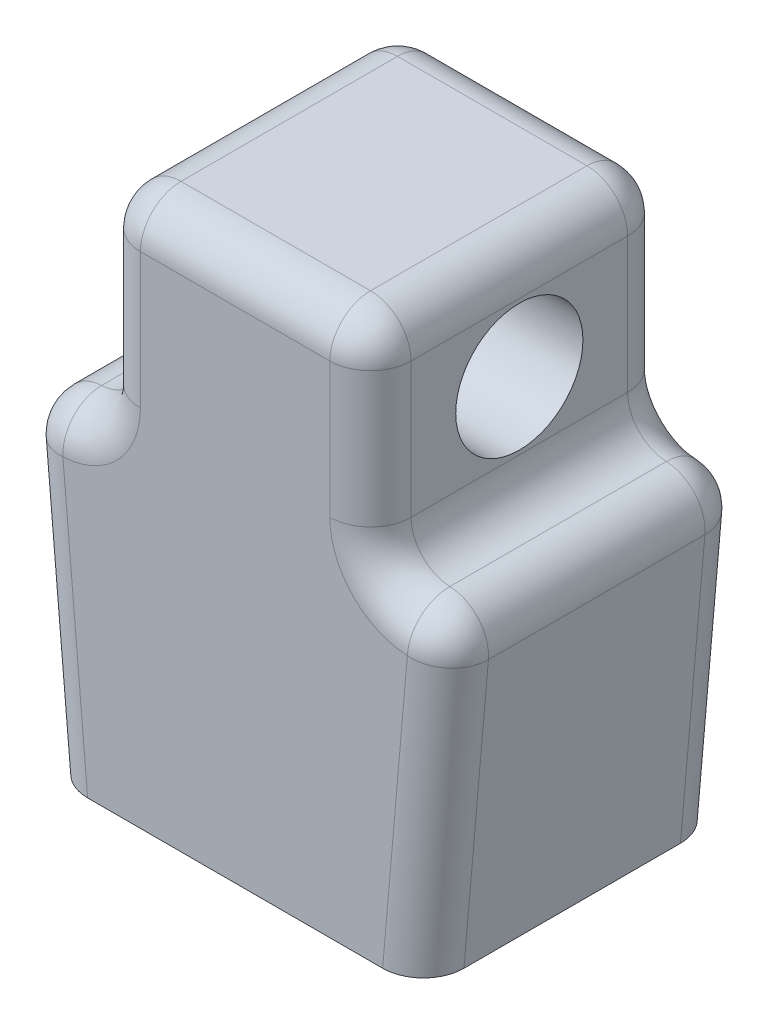
ISO-10303-21;
HEADER;
FILE_DESCRIPTION(('STEP AP214'),'2;1');
FILE_NAME('part.step','',(''),(''),'','','');
FILE_SCHEMA(('AUTOMOTIVE_DESIGN { 1 0 10303 214 1 1 1 1 }'));
ENDSEC;
DATA;
#1=APPLICATION_CONTEXT('core data for automotive mechanical design processes');
#2=APPLICATION_PROTOCOL_DEFINITION('international standard','automotive_design',2000,#1);
#3=PRODUCT_CONTEXT('',#1,'mechanical');
#4=PRODUCT('Part','Part','',(#3));
#5=PRODUCT_RELATED_PRODUCT_CATEGORY('part','',(#4));
#6=PRODUCT_DEFINITION_FORMATION('','',#4);
#7=PRODUCT_DEFINITION_CONTEXT('part definition',#1,'design');
#8=PRODUCT_DEFINITION('design','',#6,#7);
#9=PRODUCT_DEFINITION_SHAPE('','',#8);
#10=(LENGTH_UNIT() NAMED_UNIT(*) SI_UNIT(.MILLI.,.METRE.));
#11=(NAMED_UNIT(*) PLANE_ANGLE_UNIT() SI_UNIT($,.RADIAN.));
#12=(NAMED_UNIT(*) SI_UNIT($,.STERADIAN.) SOLID_ANGLE_UNIT());
#13=UNCERTAINTY_MEASURE_WITH_UNIT(LENGTH_MEASURE(1.E-05),#10,'distance_accuracy_value','');
#14=(GEOMETRIC_REPRESENTATION_CONTEXT(3) GLOBAL_UNCERTAINTY_ASSIGNED_CONTEXT((#13)) GLOBAL_UNIT_ASSIGNED_CONTEXT((#10,
#11,#12)) REPRESENTATION_CONTEXT('',''));
#15=CARTESIAN_POINT('',(0.,0.,0.));
#16=DIRECTION('',(0.,0.,1.));
#17=DIRECTION('',(1.,0.,0.));
#18=AXIS2_PLACEMENT_3D('',#15,#16,#17);
#19=CARTESIAN_POINT('',(0.,0.,-110.));
#20=DIRECTION('',(-1.,0.,0.));
#21=DIRECTION('',(0.,-1.,0.));
#22=AXIS2_PLACEMENT_3D('',#19,#20,#21);
#23=PLANE('',#22);
#24=CARTESIAN_POINT('',(0.,-40.,-55.));
#25=DIRECTION('',(-1.,0.,0.));
#26=DIRECTION('',(0.,-1.,0.));
#27=AXIS2_PLACEMENT_3D('',#24,#25,#26);
#28=CIRCLE('',#27,23.5);
#29=CARTESIAN_POINT('',(0.,-63.5,-55.));
#30=VERTEX_POINT('',#29);
#31=EDGE_CURVE('E257',#30,#30,#28,.T.);
#32=ORIENTED_EDGE('',*,*,#31,.F.);
#33=EDGE_LOOP('',(#32));
#34=FACE_BOUND('',#33,.T.);
#35=DIRECTION('',(0.,0.,1.));
#36=VECTOR('',#35,1.);
#37=CARTESIAN_POINT('',(0.,-15.,-110.));
#38=LINE('',#37,#36);
#39=CARTESIAN_POINT('',(0.,-15.,-15.));
#40=VERTEX_POINT('',#39);
#41=CARTESIAN_POINT('',(0.,-15.,-95.0000000000001));
#42=VERTEX_POINT('',#41);
#43=EDGE_CURVE('E310',#40,#42,#38,.F.);
#44=ORIENTED_EDGE('',*,*,#43,.T.);
#45=DIRECTION('',(0.,-1.,0.));
#46=VECTOR('',#45,1.);
#47=CARTESIAN_POINT('',(0.,0.,-95.0000000000001));
#48=LINE('',#47,#46);
#49=CARTESIAN_POINT('',(0.,-65.,-95.0000000000001));
#50=VERTEX_POINT('',#49);
#51=EDGE_CURVE('E11',#42,#50,#48,.T.);
#52=ORIENTED_EDGE('',*,*,#51,.T.);
#53=DIRECTION('',(0.,0.,1.));
#54=VECTOR('',#53,1.);
#55=CARTESIAN_POINT('',(0.,-65.,0.));
#56=LINE('',#55,#54);
#57=CARTESIAN_POINT('',(0.,-65.,-15.));
#58=VERTEX_POINT('',#57);
#59=EDGE_CURVE('E314',#50,#58,#56,.T.);
#60=ORIENTED_EDGE('',*,*,#59,.T.);
#61=DIRECTION('',(0.,-1.,0.));
#62=VECTOR('',#61,1.);
#63=CARTESIAN_POINT('',(0.,-15.,-15.));
#64=LINE('',#63,#62);
#65=EDGE_CURVE('E51',#58,#40,#64,.F.);
#66=ORIENTED_EDGE('',*,*,#65,.T.);
#67=EDGE_LOOP('',(#44,#52,#60,#66));
#68=FACE_BOUND('',#67,.T.);
#69=ADVANCED_FACE('F41',(#34,#68),#23,.T.);
#70=CARTESIAN_POINT('',(0.,0.,-110.));
#71=DIRECTION('',(0.,1.,0.));
#72=DIRECTION('',(0.,0.,1.));
#73=AXIS2_PLACEMENT_3D('',#70,#71,#72);
#74=PLANE('',#73);
#75=DIRECTION('',(0.,0.,1.));
#76=VECTOR('',#75,1.);
#77=CARTESIAN_POINT('',(85.,0.,-110.));
#78=LINE('',#77,#76);
#79=CARTESIAN_POINT('',(85.,0.,-15.));
#80=VERTEX_POINT('',#79);
#81=CARTESIAN_POINT('',(85.,0.,-95.0000000000001));
#82=VERTEX_POINT('',#81);
#83=EDGE_CURVE('E290',#80,#82,#78,.F.);
#84=ORIENTED_EDGE('',*,*,#83,.T.);
#85=DIRECTION('',(-1.,0.,0.));
#86=VECTOR('',#85,1.);
#87=CARTESIAN_POINT('',(0.,0.,-95.0000000000001));
#88=LINE('',#87,#86);
#89=CARTESIAN_POINT('',(15.,0.,-95.0000000000001));
#90=VERTEX_POINT('',#89);
#91=EDGE_CURVE('E294',#82,#90,#88,.T.);
#92=ORIENTED_EDGE('',*,*,#91,.T.);
#93=DIRECTION('',(0.,0.,1.));
#94=VECTOR('',#93,1.);
#95=CARTESIAN_POINT('',(15.,0.,-110.));
#96=LINE('',#95,#94);
#97=CARTESIAN_POINT('',(15.,0.,-15.));
#98=VERTEX_POINT('',#97);
#99=EDGE_CURVE('E276',#90,#98,#96,.T.);
#100=ORIENTED_EDGE('',*,*,#99,.T.);
#101=DIRECTION('',(-1.,0.,0.));
#102=VECTOR('',#101,1.);
#103=CARTESIAN_POINT('',(100.,0.,-15.));
#104=LINE('',#103,#102);
#105=EDGE_CURVE('E286',#98,#80,#104,.F.);
#106=ORIENTED_EDGE('',*,*,#105,.T.);
#107=EDGE_LOOP('',(#84,#92,#100,#106));
#108=FACE_BOUND('',#107,.T.);
#109=ADVANCED_FACE('F604',(#108),#74,.T.);
#110=CARTESIAN_POINT('',(100.,0.,-110.));
#111=DIRECTION('',(1.,0.,0.));
#112=DIRECTION('',(0.,1.,0.));
#113=AXIS2_PLACEMENT_3D('',#110,#111,#112);
#114=PLANE('',#113);
#115=CARTESIAN_POINT('',(100.,-40.,-55.));
#116=DIRECTION('',(1.,0.,0.));
#117=DIRECTION('',(0.,1.,0.));
#118=AXIS2_PLACEMENT_3D('',#115,#116,#117);
#119=CIRCLE('',#118,23.5);
#120=CARTESIAN_POINT('',(100.,-16.5,-55.));
#121=VERTEX_POINT('',#120);
#122=EDGE_CURVE('E261',#121,#121,#119,.T.);
#123=ORIENTED_EDGE('',*,*,#122,.F.);
#124=EDGE_LOOP('',(#123));
#125=FACE_BOUND('',#124,.T.);
#126=DIRECTION('',(0.,0.,1.));
#127=VECTOR('',#126,1.);
#128=CARTESIAN_POINT('',(100.,-15.,-110.));
#129=LINE('',#128,#127);
#130=CARTESIAN_POINT('',(100.,-15.,-95.0000000000001));
#131=VERTEX_POINT('',#130);
#132=CARTESIAN_POINT('',(100.,-15.,-15.));
#133=VERTEX_POINT('',#132);
#134=EDGE_CURVE('E302',#131,#133,#129,.T.);
#135=ORIENTED_EDGE('',*,*,#134,.T.);
#136=DIRECTION('',(0.,1.,0.));
#137=VECTOR('',#136,1.);
#138=CARTESIAN_POINT('',(100.,-65.,-15.));
#139=LINE('',#138,#137);
#140=CARTESIAN_POINT('',(100.,-65.,-15.));
#141=VERTEX_POINT('',#140);
#142=EDGE_CURVE('E450',#133,#141,#139,.F.);
#143=ORIENTED_EDGE('',*,*,#142,.T.);
#144=DIRECTION('',(0.,0.,1.));
#145=VECTOR('',#144,1.);
#146=CARTESIAN_POINT('',(100.,-65.,-110.));
#147=LINE('',#146,#145);
#148=CARTESIAN_POINT('',(100.,-65.,-95.0000000000001));
#149=VERTEX_POINT('',#148);
#150=EDGE_CURVE('E317',#141,#149,#147,.F.);
#151=ORIENTED_EDGE('',*,*,#150,.T.);
#152=DIRECTION('',(0.,1.,0.));
#153=VECTOR('',#152,1.);
#154=CARTESIAN_POINT('',(100.,0.,-95.0000000000001));
#155=LINE('',#154,#153);
#156=EDGE_CURVE('E447',#149,#131,#155,.T.);
#157=ORIENTED_EDGE('',*,*,#156,.T.);
#158=EDGE_LOOP('',(#135,#143,#151,#157));
#159=FACE_BOUND('',#158,.T.);
#160=ADVANCED_FACE('F615',(#125,#159),#114,.T.);
#161=CARTESIAN_POINT('',(130.,-80.,-110.));
#162=DIRECTION('',(0.996194698091745,-0.0871557427476621,0.));
#163=DIRECTION('',(0.0871557427476621,0.996194698091745,0.));
#164=AXIS2_PLACEMENT_3D('',#161,#162,#163);
#165=PLANE('',#164);
#166=DIRECTION('',(0.,0.,1.));
#167=VECTOR('',#166,1.);
#168=CARTESIAN_POINT('',(128.576018797217,-96.2761796259606,0.));
#169=LINE('',#168,#167);
#170=CARTESIAN_POINT('',(128.576018797217,-96.2761796259606,-95.0000000000001));
#171=VERTEX_POINT('',#170);
#172=CARTESIAN_POINT('',(128.576018797217,-96.2761796259606,-15.));
#173=VERTEX_POINT('',#172);
#174=EDGE_CURVE('E328',#171,#173,#169,.T.);
#175=ORIENTED_EDGE('',*,*,#174,.T.);
#176=DIRECTION('',(0.0871557427476621,0.996194698091745,0.));
#177=VECTOR('',#176,1.);
#178=CARTESIAN_POINT('',(119.541310870281,-199.543363771009,-15.));
#179=LINE('',#178,#177);
#180=CARTESIAN_POINT('',(119.541310870281,-199.543363771009,-15.));
#181=VERTEX_POINT('',#180);
#182=EDGE_CURVE('E359',#173,#181,#179,.F.);
#183=ORIENTED_EDGE('',*,*,#182,.T.);
#184=DIRECTION('',(0.,0.,1.));
#185=VECTOR('',#184,1.);
#186=CARTESIAN_POINT('',(119.541310870281,-199.543363771009,-110.));
#187=LINE('',#186,#185);
#188=CARTESIAN_POINT('',(119.541310870281,-199.543363771009,-95.0000000000001));
#189=VERTEX_POINT('',#188);
#190=EDGE_CURVE('E272',#189,#181,#187,.T.);
#191=ORIENTED_EDGE('',*,*,#190,.F.);
#192=DIRECTION('',(0.0871557427476621,0.996194698091745,0.));
#193=VECTOR('',#192,1.);
#194=CARTESIAN_POINT('',(130.,-80.,-95.0000000000001));
#195=LINE('',#194,#193);
#196=EDGE_CURVE('E355',#189,#171,#195,.T.);
#197=ORIENTED_EDGE('',*,*,#196,.T.);
#198=EDGE_LOOP('',(#175,#183,#191,#197));
#199=FACE_BOUND('',#198,.T.);
#200=ADVANCED_FACE('F563',(#199),#165,.T.);
#201=CARTESIAN_POINT('',(-19.5413108702806,-199.543363771009,-110.));
#202=DIRECTION('',(0.,-1.,0.));
#203=DIRECTION('',(0.,0.,-1.));
#204=AXIS2_PLACEMENT_3D('',#201,#202,#203);
#205=PLANE('',#204);
#206=DIRECTION('',(0.,0.,1.));
#207=VECTOR('',#206,1.);
#208=CARTESIAN_POINT('',(105.001310870281,-199.543363771009,-95.));
#209=LINE('',#208,#207);
#210=CARTESIAN_POINT('',(105.001310870281,-199.543363771009,-95.));
#211=VERTEX_POINT('',#210);
#212=CARTESIAN_POINT('',(105.001310870281,-199.543363771009,-15.));
#213=VERTEX_POINT('',#212);
#214=EDGE_CURVE('E59',#211,#213,#209,.T.);
#215=ORIENTED_EDGE('',*,*,#214,.F.);
#216=DIRECTION('',(1.,0.,0.));
#217=VECTOR('',#216,1.);
#218=CARTESIAN_POINT('',(105.001310870281,-199.543363771009,-95.));
#219=LINE('',#218,#217);
#220=CARTESIAN_POINT('',(-5.00131087028057,-199.543363771009,-95.));
#221=VERTEX_POINT('',#220);
#222=EDGE_CURVE('E229',#221,#211,#219,.T.);
#223=ORIENTED_EDGE('',*,*,#222,.F.);
#224=DIRECTION('',(0.,0.,-1.));
#225=VECTOR('',#224,1.);
#226=CARTESIAN_POINT('',(-5.00131087028057,-199.543363771009,-95.));
#227=LINE('',#226,#225);
#228=CARTESIAN_POINT('',(-5.00131087028056,-199.543363771009,-15.));
#229=VERTEX_POINT('',#228);
#230=EDGE_CURVE('E233',#229,#221,#227,.T.);
#231=ORIENTED_EDGE('',*,*,#230,.F.);
#232=DIRECTION('',(-1.,0.,0.));
#233=VECTOR('',#232,1.);
#234=CARTESIAN_POINT('',(105.001310870281,-199.543363771009,-15.));
#235=LINE('',#234,#233);
#236=EDGE_CURVE('E242',#213,#229,#235,.T.);
#237=ORIENTED_EDGE('',*,*,#236,.F.);
#238=EDGE_LOOP('',(#215,#223,#231,#237));
#239=FACE_BOUND('',#238,.T.);
#240=ORIENTED_EDGE('',*,*,#190,.T.);
#241=CARTESIAN_POINT('',(104.48401330713,-199.543363771009,-15.));
#242=DIRECTION('',(0.,-1.,0.));
#243=DIRECTION('',(-1.,0.,0.));
#244=AXIS2_PLACEMENT_3D('',#241,#242,#243);
#245=ELLIPSE('',#244,15.0572975631502,15.);
#246=CARTESIAN_POINT('',(104.48401330713,-199.543363771009,0.));
#247=VERTEX_POINT('',#246);
#248=EDGE_CURVE('E371',#181,#247,#245,.T.);
#249=ORIENTED_EDGE('',*,*,#248,.T.);
#250=DIRECTION('',(1.,0.,0.));
#251=VECTOR('',#250,1.);
#252=CARTESIAN_POINT('',(-19.5413108702806,-199.543363771009,0.));
#253=LINE('',#252,#251);
#254=CARTESIAN_POINT('',(-4.48401330713034,-199.543363771009,0.));
#255=VERTEX_POINT('',#254);
#256=EDGE_CURVE('E268',#255,#247,#253,.T.);
#257=ORIENTED_EDGE('',*,*,#256,.F.);
#258=CARTESIAN_POINT('',(-4.48401330713034,-199.543363771009,-15.));
#259=DIRECTION('',(0.,-1.,0.));
#260=DIRECTION('',(-1.,0.,0.));
#261=AXIS2_PLACEMENT_3D('',#258,#259,#260);
#262=ELLIPSE('',#261,15.0572975631502,15.);
#263=CARTESIAN_POINT('',(-19.5413108702806,-199.543363771009,-15.));
#264=VERTEX_POINT('',#263);
#265=EDGE_CURVE('E362',#255,#264,#262,.T.);
#266=ORIENTED_EDGE('',*,*,#265,.T.);
#267=DIRECTION('',(0.,0.,1.));
#268=VECTOR('',#267,1.);
#269=CARTESIAN_POINT('',(-19.5413108702806,-199.543363771009,-110.));
#270=LINE('',#269,#268);
#271=CARTESIAN_POINT('',(-19.5413108702806,-199.543363771009,-95.0000000000001));
#272=VERTEX_POINT('',#271);
#273=EDGE_CURVE('E267',#272,#264,#270,.T.);
#274=ORIENTED_EDGE('',*,*,#273,.F.);
#275=CARTESIAN_POINT('',(-4.48401330713034,-199.543363771009,-95.0000000000001));
#276=DIRECTION('',(0.,-1.,0.));
#277=DIRECTION('',(1.,0.,0.));
#278=AXIS2_PLACEMENT_3D('',#275,#276,#277);
#279=ELLIPSE('',#278,15.0572975631502,15.);
#280=CARTESIAN_POINT('',(-4.48401330713034,-199.543363771009,-110.));
#281=VERTEX_POINT('',#280);
#282=EDGE_CURVE('E365',#272,#281,#279,.T.);
#283=ORIENTED_EDGE('',*,*,#282,.T.);
#284=DIRECTION('',(1.,0.,0.));
#285=VECTOR('',#284,1.);
#286=CARTESIAN_POINT('',(-19.5413108702806,-199.543363771009,-110.));
#287=LINE('',#286,#285);
#288=CARTESIAN_POINT('',(104.48401330713,-199.543363771009,-110.));
#289=VERTEX_POINT('',#288);
#290=EDGE_CURVE('E263',#281,#289,#287,.T.);
#291=ORIENTED_EDGE('',*,*,#290,.T.);
#292=CARTESIAN_POINT('',(104.48401330713,-199.543363771009,-95.0000000000001));
#293=DIRECTION('',(0.,-1.,0.));
#294=DIRECTION('',(1.,0.,0.));
#295=AXIS2_PLACEMENT_3D('',#292,#293,#294);
#296=ELLIPSE('',#295,15.0572975631502,15.);
#297=EDGE_CURVE('E368',#289,#189,#296,.T.);
#298=ORIENTED_EDGE('',*,*,#297,.T.);
#299=EDGE_LOOP('',(#240,#249,#257,#266,#274,#283,#291,#298));
#300=FACE_BOUND('',#299,.T.);
#301=ADVANCED_FACE('F527',(#239,#300),#205,.T.);
#302=CARTESIAN_POINT('',(-30.,-80.,-110.));
#303=DIRECTION('',(-0.996194698091745,-0.0871557427476619,0.));
#304=DIRECTION('',(0.0871557427476619,-0.996194698091745,0.));
#305=AXIS2_PLACEMENT_3D('',#302,#303,#304);
#306=PLANE('',#305);
#307=DIRECTION('',(0.,0.,1.));
#308=VECTOR('',#307,1.);
#309=CARTESIAN_POINT('',(-28.5760187972168,-96.2761796259606,-110.));
#310=LINE('',#309,#308);
#311=CARTESIAN_POINT('',(-28.5760187972168,-96.2761796259606,-15.));
#312=VERTEX_POINT('',#311);
#313=CARTESIAN_POINT('',(-28.5760187972168,-96.2761796259606,-95.0000000000001));
#314=VERTEX_POINT('',#313);
#315=EDGE_CURVE('E324',#312,#314,#310,.F.);
#316=ORIENTED_EDGE('',*,*,#315,.T.);
#317=DIRECTION('',(0.0871557427476619,-0.996194698091745,0.));
#318=VECTOR('',#317,1.);
#319=CARTESIAN_POINT('',(-30.,-80.,-95.0000000000001));
#320=LINE('',#319,#318);
#321=EDGE_CURVE('E433',#314,#272,#320,.T.);
#322=ORIENTED_EDGE('',*,*,#321,.T.);
#323=ORIENTED_EDGE('',*,*,#273,.T.);
#324=DIRECTION('',(0.0871557427476619,-0.996194698091745,0.));
#325=VECTOR('',#324,1.);
#326=CARTESIAN_POINT('',(-28.5760187972168,-96.2761796259606,-15.));
#327=LINE('',#326,#325);
#328=EDGE_CURVE('E430',#264,#312,#327,.F.);
#329=ORIENTED_EDGE('',*,*,#328,.T.);
#330=EDGE_LOOP('',(#316,#322,#323,#329));
#331=FACE_BOUND('',#330,.T.);
#332=ADVANCED_FACE('F645',(#331),#306,.T.);
#333=CARTESIAN_POINT('',(0.,0.,-110.));
#334=DIRECTION('',(0.,0.,-1.));
#335=DIRECTION('',(-1.,0.,0.));
#336=AXIS2_PLACEMENT_3D('',#333,#334,#335);
#337=PLANE('',#336);
#338=CARTESIAN_POINT('',(115.,-65.,-110.));
#339=DIRECTION('',(0.,0.,-1.));
#340=DIRECTION('',(-1.,0.,0.));
#341=AXIS2_PLACEMENT_3D('',#338,#339,#340);
#342=CIRCLE('',#341,30.);
#343=CARTESIAN_POINT('',(85.,-65.,-110.));
#344=VERTEX_POINT('',#343);
#345=CARTESIAN_POINT('',(113.633098325841,-94.9688434847456,-110.));
#346=VERTEX_POINT('',#345);
#347=EDGE_CURVE('E410',#344,#346,#342,.F.);
#348=ORIENTED_EDGE('',*,*,#347,.T.);
#349=DIRECTION('',(0.0871557427476621,0.996194698091745,0.));
#350=VECTOR('',#349,1.);
#351=CARTESIAN_POINT('',(121.015510581095,-10.5874852866478,-110.));
#352=LINE('',#351,#350);
#353=EDGE_CURVE('E413',#346,#289,#352,.F.);
#354=ORIENTED_EDGE('',*,*,#353,.T.);
#355=ORIENTED_EDGE('',*,*,#290,.F.);
#356=DIRECTION('',(0.0871557427476619,-0.996194698091745,0.));
#357=VECTOR('',#356,1.);
#358=CARTESIAN_POINT('',(-21.7751229304844,-1.90507640330087,-110.));
#359=LINE('',#358,#357);
#360=CARTESIAN_POINT('',(-13.6330983258406,-94.9688434847456,-110.));
#361=VERTEX_POINT('',#360);
#362=EDGE_CURVE('E404',#281,#361,#359,.F.);
#363=ORIENTED_EDGE('',*,*,#362,.T.);
#364=CARTESIAN_POINT('',(-15.,-65.,-110.));
#365=DIRECTION('',(0.,0.,-1.));
#366=DIRECTION('',(-1.,0.,0.));
#367=AXIS2_PLACEMENT_3D('',#364,#365,#366);
#368=CIRCLE('',#367,30.);
#369=CARTESIAN_POINT('',(15.,-65.,-110.));
#370=VERTEX_POINT('',#369);
#371=EDGE_CURVE('E401',#361,#370,#368,.F.);
#372=ORIENTED_EDGE('',*,*,#371,.T.);
#373=DIRECTION('',(0.,-1.,0.));
#374=VECTOR('',#373,1.);
#375=CARTESIAN_POINT('',(15.,0.,-110.));
#376=LINE('',#375,#374);
#377=CARTESIAN_POINT('',(15.,-15.,-110.));
#378=VERTEX_POINT('',#377);
#379=EDGE_CURVE('E398',#370,#378,#376,.F.);
#380=ORIENTED_EDGE('',*,*,#379,.T.);
#381=DIRECTION('',(-1.,0.,0.));
#382=VECTOR('',#381,1.);
#383=CARTESIAN_POINT('',(0.,-15.,-110.));
#384=LINE('',#383,#382);
#385=CARTESIAN_POINT('',(85.,-15.,-110.));
#386=VERTEX_POINT('',#385);
#387=EDGE_CURVE('E298',#378,#386,#384,.F.);
#388=ORIENTED_EDGE('',*,*,#387,.T.);
#389=DIRECTION('',(0.,1.,0.));
#390=VECTOR('',#389,1.);
#391=CARTESIAN_POINT('',(85.,0.,-110.));
#392=LINE('',#391,#390);
#393=EDGE_CURVE('E407',#386,#344,#392,.F.);
#394=ORIENTED_EDGE('',*,*,#393,.T.);
#395=EDGE_LOOP('',(#348,#354,#355,#363,#372,#380,#388,#394));
#396=FACE_BOUND('',#395,.T.);
#397=ADVANCED_FACE('F570',(#396),#337,.T.);
#398=CARTESIAN_POINT('',(0.,0.,0.));
#399=DIRECTION('',(0.,0.,-1.));
#400=DIRECTION('',(-1.,0.,0.));
#401=AXIS2_PLACEMENT_3D('',#398,#399,#400);
#402=PLANE('',#401);
#403=ORIENTED_EDGE('',*,*,#256,.T.);
#404=DIRECTION('',(0.0871557427476621,0.996194698091745,0.));
#405=VECTOR('',#404,1.);
#406=CARTESIAN_POINT('',(113.633098325841,-94.9688434847456,0.));
#407=LINE('',#406,#405);
#408=CARTESIAN_POINT('',(113.633098325841,-94.9688434847456,0.));
#409=VERTEX_POINT('',#408);
#410=EDGE_CURVE('E351',#247,#409,#407,.T.);
#411=ORIENTED_EDGE('',*,*,#410,.T.);
#412=CARTESIAN_POINT('',(115.,-65.,0.));
#413=DIRECTION('',(0.,0.,-1.));
#414=DIRECTION('',(-1.,0.,0.));
#415=AXIS2_PLACEMENT_3D('',#412,#413,#414);
#416=CIRCLE('',#415,30.);
#417=CARTESIAN_POINT('',(85.,-65.,0.));
#418=VERTEX_POINT('',#417);
#419=EDGE_CURVE('E348',#409,#418,#416,.T.);
#420=ORIENTED_EDGE('',*,*,#419,.T.);
#421=DIRECTION('',(0.,1.,0.));
#422=VECTOR('',#421,1.);
#423=CARTESIAN_POINT('',(85.,-15.,0.));
#424=LINE('',#423,#422);
#425=CARTESIAN_POINT('',(85.,-15.,0.));
#426=VERTEX_POINT('',#425);
#427=EDGE_CURVE('E345',#418,#426,#424,.T.);
#428=ORIENTED_EDGE('',*,*,#427,.T.);
#429=DIRECTION('',(-1.,0.,0.));
#430=VECTOR('',#429,1.);
#431=CARTESIAN_POINT('',(0.,-15.,0.));
#432=LINE('',#431,#430);
#433=CARTESIAN_POINT('',(15.,-15.,0.));
#434=VERTEX_POINT('',#433);
#435=EDGE_CURVE('E306',#426,#434,#432,.T.);
#436=ORIENTED_EDGE('',*,*,#435,.T.);
#437=DIRECTION('',(0.,-1.,0.));
#438=VECTOR('',#437,1.);
#439=CARTESIAN_POINT('',(15.,-65.,0.));
#440=LINE('',#439,#438);
#441=CARTESIAN_POINT('',(15.,-65.,0.));
#442=VERTEX_POINT('',#441);
#443=EDGE_CURVE('E336',#434,#442,#440,.T.);
#444=ORIENTED_EDGE('',*,*,#443,.T.);
#445=CARTESIAN_POINT('',(-15.,-65.,0.));
#446=DIRECTION('',(0.,0.,-1.));
#447=DIRECTION('',(-1.,0.,0.));
#448=AXIS2_PLACEMENT_3D('',#445,#446,#447);
#449=CIRCLE('',#448,30.);
#450=CARTESIAN_POINT('',(-13.6330983258406,-94.9688434847456,0.));
#451=VERTEX_POINT('',#450);
#452=EDGE_CURVE('E339',#442,#451,#449,.T.);
#453=ORIENTED_EDGE('',*,*,#452,.T.);
#454=DIRECTION('',(0.0871557427476619,-0.996194698091745,0.));
#455=VECTOR('',#454,1.);
#456=CARTESIAN_POINT('',(-4.59839039890438,-198.236027629795,0.));
#457=LINE('',#456,#455);
#458=EDGE_CURVE('E342',#451,#255,#457,.T.);
#459=ORIENTED_EDGE('',*,*,#458,.T.);
#460=EDGE_LOOP('',(#403,#411,#420,#428,#436,#444,#453,#459));
#461=FACE_BOUND('',#460,.T.);
#462=ADVANCED_FACE('F524',(#461),#402,.F.);
#463=CARTESIAN_POINT('',(130.,-40.,-55.));
#464=DIRECTION('',(-1.,0.,0.));
#465=DIRECTION('',(0.,-1.,0.));
#466=AXIS2_PLACEMENT_3D('',#463,#464,#465);
#467=CYLINDRICAL_SURFACE('',#466,23.5);
#468=ORIENTED_EDGE('',*,*,#122,.T.);
#469=EDGE_LOOP('',(#468));
#470=FACE_BOUND('',#469,.T.);
#471=ORIENTED_EDGE('',*,*,#31,.T.);
#472=EDGE_LOOP('',(#471));
#473=FACE_BOUND('',#472,.T.);
#474=ADVANCED_FACE('F657',(#470,#473),#467,.F.);
#475=CARTESIAN_POINT('',(0.,-15.,-15.));
#476=DIRECTION('',(1.,0.,0.));
#477=DIRECTION('',(0.,0.,-1.));
#478=AXIS2_PLACEMENT_3D('',#475,#476,#477);
#479=CYLINDRICAL_SURFACE('',#478,15.);
#480=ORIENTED_EDGE('',*,*,#435,.F.);
#481=CARTESIAN_POINT('',(85.,-15.,-15.));
#482=DIRECTION('',(1.,0.,0.));
#483=DIRECTION('',(0.,0.,-1.));
#484=AXIS2_PLACEMENT_3D('',#481,#482,#483);
#485=CIRCLE('',#484,15.);
#486=EDGE_CURVE('E395',#426,#80,#485,.F.);
#487=ORIENTED_EDGE('',*,*,#486,.T.);
#488=ORIENTED_EDGE('',*,*,#105,.F.);
#489=CARTESIAN_POINT('',(15.,-15.,-15.));
#490=DIRECTION('',(1.,0.,0.));
#491=DIRECTION('',(0.,0.,-1.));
#492=AXIS2_PLACEMENT_3D('',#489,#490,#491);
#493=CIRCLE('',#492,15.);
#494=EDGE_CURVE('E392',#98,#434,#493,.T.);
#495=ORIENTED_EDGE('',*,*,#494,.T.);
#496=EDGE_LOOP('',(#480,#487,#488,#495));
#497=FACE_BOUND('',#496,.T.);
#498=ADVANCED_FACE('F654',(#497),#479,.T.);
#499=CARTESIAN_POINT('',(85.,-15.,-110.));
#500=DIRECTION('',(0.,0.,1.));
#501=DIRECTION('',(1.,0.,0.));
#502=AXIS2_PLACEMENT_3D('',#499,#500,#501);
#503=CYLINDRICAL_SURFACE('',#502,15.);
#504=ORIENTED_EDGE('',*,*,#83,.F.);
#505=CARTESIAN_POINT('',(85.,-15.,-15.));
#506=DIRECTION('',(0.,0.,1.));
#507=DIRECTION('',(1.,0.,0.));
#508=AXIS2_PLACEMENT_3D('',#505,#506,#507);
#509=CIRCLE('',#508,15.);
#510=EDGE_CURVE('E389',#80,#133,#509,.F.);
#511=ORIENTED_EDGE('',*,*,#510,.T.);
#512=ORIENTED_EDGE('',*,*,#134,.F.);
#513=CARTESIAN_POINT('',(85.,-15.,-95.0000000000001));
#514=DIRECTION('',(0.,0.,1.));
#515=DIRECTION('',(1.,0.,0.));
#516=AXIS2_PLACEMENT_3D('',#513,#514,#515);
#517=CIRCLE('',#516,15.);
#518=EDGE_CURVE('E386',#131,#82,#517,.T.);
#519=ORIENTED_EDGE('',*,*,#518,.T.);
#520=EDGE_LOOP('',(#504,#511,#512,#519));
#521=FACE_BOUND('',#520,.T.);
#522=ADVANCED_FACE('F608',(#521),#503,.T.);
#523=CARTESIAN_POINT('',(15.,-15.,-110.));
#524=DIRECTION('',(0.,0.,1.));
#525=DIRECTION('',(1.,0.,0.));
#526=AXIS2_PLACEMENT_3D('',#523,#524,#525);
#527=CYLINDRICAL_SURFACE('',#526,15.);
#528=ORIENTED_EDGE('',*,*,#99,.F.);
#529=CARTESIAN_POINT('',(15.,-15.,-95.0000000000001));
#530=DIRECTION('',(0.,0.,1.));
#531=DIRECTION('',(1.,0.,0.));
#532=AXIS2_PLACEMENT_3D('',#529,#530,#531);
#533=CIRCLE('',#532,15.);
#534=EDGE_CURVE('E427',#90,#42,#533,.T.);
#535=ORIENTED_EDGE('',*,*,#534,.T.);
#536=ORIENTED_EDGE('',*,*,#43,.F.);
#537=CARTESIAN_POINT('',(15.,-15.,-15.));
#538=DIRECTION('',(0.,0.,1.));
#539=DIRECTION('',(1.,0.,0.));
#540=AXIS2_PLACEMENT_3D('',#537,#538,#539);
#541=CIRCLE('',#540,15.);
#542=EDGE_CURVE('E423',#40,#98,#541,.F.);
#543=ORIENTED_EDGE('',*,*,#542,.T.);
#544=EDGE_LOOP('',(#528,#535,#536,#543));
#545=FACE_BOUND('',#544,.T.);
#546=ADVANCED_FACE('F599',(#545),#527,.T.);
#547=CARTESIAN_POINT('',(0.,-15.,-95.0000000000001));
#548=DIRECTION('',(-1.,0.,0.));
#549=DIRECTION('',(0.,0.,1.));
#550=AXIS2_PLACEMENT_3D('',#547,#548,#549);
#551=CYLINDRICAL_SURFACE('',#550,15.);
#552=ORIENTED_EDGE('',*,*,#91,.F.);
#553=CARTESIAN_POINT('',(85.,-15.,-95.0000000000001));
#554=DIRECTION('',(-1.,0.,0.));
#555=DIRECTION('',(0.,0.,1.));
#556=AXIS2_PLACEMENT_3D('',#553,#554,#555);
#557=CIRCLE('',#556,15.);
#558=EDGE_CURVE('E420',#82,#386,#557,.T.);
#559=ORIENTED_EDGE('',*,*,#558,.T.);
#560=ORIENTED_EDGE('',*,*,#387,.F.);
#561=CARTESIAN_POINT('',(15.,-15.,-95.0000000000001));
#562=DIRECTION('',(-1.,0.,0.));
#563=DIRECTION('',(0.,0.,1.));
#564=AXIS2_PLACEMENT_3D('',#561,#562,#563);
#565=CIRCLE('',#564,15.);
#566=EDGE_CURVE('E416',#378,#90,#565,.F.);
#567=ORIENTED_EDGE('',*,*,#566,.T.);
#568=EDGE_LOOP('',(#552,#559,#560,#567));
#569=FACE_BOUND('',#568,.T.);
#570=ADVANCED_FACE('F596',(#569),#551,.T.);
#571=CARTESIAN_POINT('',(-15.,-65.,-110.));
#572=DIRECTION('',(0.,0.,-1.));
#573=DIRECTION('',(-1.,0.,0.));
#574=AXIS2_PLACEMENT_3D('',#571,#572,#573);
#575=CYLINDRICAL_SURFACE('',#574,15.);
#576=ORIENTED_EDGE('',*,*,#59,.F.);
#577=CARTESIAN_POINT('',(-15.,-65.,-95.0000000000001));
#578=DIRECTION('',(0.,0.,-1.));
#579=DIRECTION('',(-1.,0.,0.));
#580=AXIS2_PLACEMENT_3D('',#577,#578,#579);
#581=CIRCLE('',#580,15.);
#582=CARTESIAN_POINT('',(-14.3165491629203,-79.9844217423728,-95.0000000000001));
#583=VERTEX_POINT('',#582);
#584=EDGE_CURVE('E444',#50,#583,#581,.T.);
#585=ORIENTED_EDGE('',*,*,#584,.T.);
#586=DIRECTION('',(0.,0.,-1.));
#587=VECTOR('',#586,1.);
#588=CARTESIAN_POINT('',(-14.3165491629203,-79.9844217423728,-110.));
#589=LINE('',#588,#587);
#590=CARTESIAN_POINT('',(-14.3165491629203,-79.9844217423728,-15.));
#591=VERTEX_POINT('',#590);
#592=EDGE_CURVE('E321',#583,#591,#589,.F.);
#593=ORIENTED_EDGE('',*,*,#592,.T.);
#594=CARTESIAN_POINT('',(-15.,-65.,-15.));
#595=DIRECTION('',(0.,0.,-1.));
#596=DIRECTION('',(-1.,0.,0.));
#597=AXIS2_PLACEMENT_3D('',#594,#595,#596);
#598=CIRCLE('',#597,15.);
#599=EDGE_CURVE('E67',#591,#58,#598,.F.);
#600=ORIENTED_EDGE('',*,*,#599,.T.);
#601=EDGE_LOOP('',(#576,#585,#593,#600));
#602=FACE_BOUND('',#601,.T.);
#603=ADVANCED_FACE('F649',(#602),#575,.F.);
#604=CARTESIAN_POINT('',(115.,-65.,-110.));
#605=DIRECTION('',(0.,0.,-1.));
#606=DIRECTION('',(-1.,0.,0.));
#607=AXIS2_PLACEMENT_3D('',#604,#605,#606);
#608=CYLINDRICAL_SURFACE('',#607,15.);
#609=ORIENTED_EDGE('',*,*,#150,.F.);
#610=CARTESIAN_POINT('',(115.,-65.,-15.));
#611=DIRECTION('',(0.,0.,-1.));
#612=DIRECTION('',(-1.,0.,0.));
#613=AXIS2_PLACEMENT_3D('',#610,#611,#612);
#614=CIRCLE('',#613,15.);
#615=CARTESIAN_POINT('',(114.31654916292,-79.9844217423728,-15.));
#616=VERTEX_POINT('',#615);
#617=EDGE_CURVE('E383',#141,#616,#614,.F.);
#618=ORIENTED_EDGE('',*,*,#617,.T.);
#619=DIRECTION('',(0.,0.,-1.));
#620=VECTOR('',#619,1.);
#621=CARTESIAN_POINT('',(114.31654916292,-79.9844217423728,-110.));
#622=LINE('',#621,#620);
#623=CARTESIAN_POINT('',(114.31654916292,-79.9844217423728,-95.0000000000001));
#624=VERTEX_POINT('',#623);
#625=EDGE_CURVE('E332',#616,#624,#622,.T.);
#626=ORIENTED_EDGE('',*,*,#625,.T.);
#627=CARTESIAN_POINT('',(115.,-65.,-95.0000000000001));
#628=DIRECTION('',(0.,0.,-1.));
#629=DIRECTION('',(-1.,0.,0.));
#630=AXIS2_PLACEMENT_3D('',#627,#628,#629);
#631=CIRCLE('',#630,15.);
#632=EDGE_CURVE('E380',#624,#149,#631,.T.);
#633=ORIENTED_EDGE('',*,*,#632,.T.);
#634=EDGE_LOOP('',(#609,#618,#626,#633));
#635=FACE_BOUND('',#634,.T.);
#636=ADVANCED_FACE('F551',(#635),#608,.F.);
#637=CARTESIAN_POINT('',(-13.6330983258406,-94.9688434847456,-110.));
#638=DIRECTION('',(0.,0.,-1.));
#639=DIRECTION('',(-1.,0.,0.));
#640=AXIS2_PLACEMENT_3D('',#637,#638,#639);
#641=CYLINDRICAL_SURFACE('',#640,15.);
#642=ORIENTED_EDGE('',*,*,#592,.F.);
#643=CARTESIAN_POINT('',(-13.6330983258406,-94.9688434847456,-95.0000000000001));
#644=DIRECTION('',(0.,0.,-1.));
#645=DIRECTION('',(-1.,0.,0.));
#646=AXIS2_PLACEMENT_3D('',#643,#644,#645);
#647=CIRCLE('',#646,15.);
#648=EDGE_CURVE('E439',#583,#314,#647,.F.);
#649=ORIENTED_EDGE('',*,*,#648,.T.);
#650=ORIENTED_EDGE('',*,*,#315,.F.);
#651=CARTESIAN_POINT('',(-13.6330983258406,-94.9688434847456,-15.));
#652=DIRECTION('',(0.,0.,-1.));
#653=DIRECTION('',(-1.,0.,0.));
#654=AXIS2_PLACEMENT_3D('',#651,#652,#653);
#655=CIRCLE('',#654,15.);
#656=EDGE_CURVE('E436',#312,#591,#655,.T.);
#657=ORIENTED_EDGE('',*,*,#656,.T.);
#658=EDGE_LOOP('',(#642,#649,#650,#657));
#659=FACE_BOUND('',#658,.T.);
#660=ADVANCED_FACE('F663',(#659),#641,.T.);
#661=CARTESIAN_POINT('',(113.633098325841,-94.9688434847456,-110.));
#662=DIRECTION('',(0.,0.,-1.));
#663=DIRECTION('',(-1.,0.,0.));
#664=AXIS2_PLACEMENT_3D('',#661,#662,#663);
#665=CYLINDRICAL_SURFACE('',#664,15.);
#666=ORIENTED_EDGE('',*,*,#625,.F.);
#667=CARTESIAN_POINT('',(113.633098325841,-94.9688434847456,-15.));
#668=DIRECTION('',(0.,0.,-1.));
#669=DIRECTION('',(-1.,0.,0.));
#670=AXIS2_PLACEMENT_3D('',#667,#668,#669);
#671=CIRCLE('',#670,15.);
#672=EDGE_CURVE('E377',#616,#173,#671,.T.);
#673=ORIENTED_EDGE('',*,*,#672,.T.);
#674=ORIENTED_EDGE('',*,*,#174,.F.);
#675=CARTESIAN_POINT('',(113.633098325841,-94.9688434847456,-95.0000000000001));
#676=DIRECTION('',(0.,0.,-1.));
#677=DIRECTION('',(-1.,0.,0.));
#678=AXIS2_PLACEMENT_3D('',#675,#676,#677);
#679=CIRCLE('',#678,15.);
#680=EDGE_CURVE('E374',#171,#624,#679,.F.);
#681=ORIENTED_EDGE('',*,*,#680,.T.);
#682=EDGE_LOOP('',(#666,#673,#674,#681));
#683=FACE_BOUND('',#682,.T.);
#684=ADVANCED_FACE('F554',(#683),#665,.T.);
#685=CARTESIAN_POINT('',(85.,-15.,-15.));
#686=DIRECTION('',(0.,0.,1.));
#687=DIRECTION('',(1.,0.,0.));
#688=AXIS2_PLACEMENT_3D('',#685,#686,#687);
#689=SPHERICAL_SURFACE('',#688,15.);
#690=ORIENTED_EDGE('',*,*,#510,.F.);
#691=ORIENTED_EDGE('',*,*,#486,.F.);
#692=CARTESIAN_POINT('',(85.,-15.,-15.));
#693=DIRECTION('',(0.,-1.,0.));
#694=DIRECTION('',(1.,0.,0.));
#695=AXIS2_PLACEMENT_3D('',#692,#693,#694);
#696=CIRCLE('',#695,15.);
#697=EDGE_CURVE('E262',#133,#426,#696,.T.);
#698=ORIENTED_EDGE('',*,*,#697,.F.);
#699=EDGE_LOOP('',(#690,#691,#698));
#700=FACE_BOUND('',#699,.T.);
#701=ADVANCED_FACE('F613',(#700),#689,.T.);
#702=CARTESIAN_POINT('',(85.,0.,-15.));
#703=DIRECTION('',(0.,-1.,0.));
#704=DIRECTION('',(1.,0.,0.));
#705=AXIS2_PLACEMENT_3D('',#702,#703,#704);
#706=CYLINDRICAL_SURFACE('',#705,15.);
#707=ORIENTED_EDGE('',*,*,#697,.T.);
#708=ORIENTED_EDGE('',*,*,#427,.F.);
#709=CARTESIAN_POINT('',(85.,-65.,-15.));
#710=DIRECTION('',(0.,-1.,0.));
#711=DIRECTION('',(0.,0.,-1.));
#712=AXIS2_PLACEMENT_3D('',#709,#710,#711);
#713=CIRCLE('',#712,15.);
#714=EDGE_CURVE('E463',#141,#418,#713,.T.);
#715=ORIENTED_EDGE('',*,*,#714,.F.);
#716=ORIENTED_EDGE('',*,*,#142,.F.);
#717=EDGE_LOOP('',(#707,#708,#715,#716));
#718=FACE_BOUND('',#717,.T.);
#719=ADVANCED_FACE('F542',(#718),#706,.T.);
#720=CARTESIAN_POINT('',(115.,-65.,-15.));
#721=DIRECTION('',(0.,0.,-1.));
#722=DIRECTION('',(-1.,0.,0.));
#723=AXIS2_PLACEMENT_3D('',#720,#721,#722);
#724=TOROIDAL_SURFACE('',#723,30.,15.);
#725=CARTESIAN_POINT('',(113.633098325841,-94.9688434847456,-15.));
#726=DIRECTION('',(0.998961449491521,-0.0455633891386457,0.));
#727=DIRECTION('',(0.0455633891386457,0.998961449491521,0.));
#728=AXIS2_PLACEMENT_3D('',#725,#726,#727);
#729=CIRCLE('',#728,15.);
#730=EDGE_CURVE('E458',#616,#409,#729,.T.);
#731=ORIENTED_EDGE('',*,*,#730,.F.);
#732=ORIENTED_EDGE('',*,*,#617,.F.);
#733=ORIENTED_EDGE('',*,*,#714,.T.);
#734=ORIENTED_EDGE('',*,*,#419,.F.);
#735=EDGE_LOOP('',(#731,#732,#733,#734));
#736=FACE_BOUND('',#735,.T.);
#737=ADVANCED_FACE('F546',(#736),#724,.T.);
#738=CARTESIAN_POINT('',(113.633098325841,-94.9688434847456,-15.));
#739=DIRECTION('',(0.,0.,-1.));
#740=DIRECTION('',(-1.,0.,0.));
#741=AXIS2_PLACEMENT_3D('',#738,#739,#740);
#742=SPHERICAL_SURFACE('',#741,15.);
#743=ORIENTED_EDGE('',*,*,#672,.F.);
#744=ORIENTED_EDGE('',*,*,#730,.T.);
#745=CARTESIAN_POINT('',(113.633098325841,-94.9688434847456,-15.));
#746=DIRECTION('',(-0.0871557427476624,-0.996194698091745,0.));
#747=DIRECTION('',(0.996194698091745,-0.0871557427476624,0.));
#748=AXIS2_PLACEMENT_3D('',#745,#746,#747);
#749=CIRCLE('',#748,15.);
#750=EDGE_CURVE('E455',#173,#409,#749,.T.);
#751=ORIENTED_EDGE('',*,*,#750,.F.);
#752=EDGE_LOOP('',(#743,#744,#751));
#753=FACE_BOUND('',#752,.T.);
#754=ADVANCED_FACE('F671',(#753),#742,.T.);
#755=CARTESIAN_POINT('',(121.015510581095,-10.5874852866478,-15.));
#756=DIRECTION('',(-0.0871557427476621,-0.996194698091745,0.));
#757=DIRECTION('',(0.996194698091745,-0.0871557427476621,0.));
#758=AXIS2_PLACEMENT_3D('',#755,#756,#757);
#759=CYLINDRICAL_SURFACE('',#758,15.);
#760=ORIENTED_EDGE('',*,*,#248,.F.);
#761=ORIENTED_EDGE('',*,*,#182,.F.);
#762=ORIENTED_EDGE('',*,*,#750,.T.);
#763=ORIENTED_EDGE('',*,*,#410,.F.);
#764=EDGE_LOOP('',(#760,#761,#762,#763));
#765=FACE_BOUND('',#764,.T.);
#766=ADVANCED_FACE('F533',(#765),#759,.T.);
#767=CARTESIAN_POINT('',(85.,-15.,-95.0000000000001));
#768=DIRECTION('',(0.,0.,1.));
#769=DIRECTION('',(1.,0.,0.));
#770=AXIS2_PLACEMENT_3D('',#767,#768,#769);
#771=SPHERICAL_SURFACE('',#770,15.);
#772=ORIENTED_EDGE('',*,*,#558,.F.);
#773=ORIENTED_EDGE('',*,*,#518,.F.);
#774=CARTESIAN_POINT('',(85.,-15.,-95.0000000000001));
#775=DIRECTION('',(0.,-1.,0.));
#776=DIRECTION('',(1.,0.,0.));
#777=AXIS2_PLACEMENT_3D('',#774,#775,#776);
#778=CIRCLE('',#777,15.);
#779=EDGE_CURVE('E459',#386,#131,#778,.T.);
#780=ORIENTED_EDGE('',*,*,#779,.F.);
#781=EDGE_LOOP('',(#772,#773,#780));
#782=FACE_BOUND('',#781,.T.);
#783=ADVANCED_FACE('F619',(#782),#771,.T.);
#784=CARTESIAN_POINT('',(85.,0.,-95.0000000000001));
#785=DIRECTION('',(0.,1.,0.));
#786=DIRECTION('',(-1.,0.,0.));
#787=AXIS2_PLACEMENT_3D('',#784,#785,#786);
#788=CYLINDRICAL_SURFACE('',#787,15.);
#789=ORIENTED_EDGE('',*,*,#779,.T.);
#790=ORIENTED_EDGE('',*,*,#156,.F.);
#791=CARTESIAN_POINT('',(85.,-65.,-95.0000000000001));
#792=DIRECTION('',(0.,-1.,0.));
#793=DIRECTION('',(0.,0.,-1.));
#794=AXIS2_PLACEMENT_3D('',#791,#792,#793);
#795=CIRCLE('',#794,15.);
#796=EDGE_CURVE('E478',#344,#149,#795,.T.);
#797=ORIENTED_EDGE('',*,*,#796,.F.);
#798=ORIENTED_EDGE('',*,*,#393,.F.);
#799=EDGE_LOOP('',(#789,#790,#797,#798));
#800=FACE_BOUND('',#799,.T.);
#801=ADVANCED_FACE('F622',(#800),#788,.T.);
#802=CARTESIAN_POINT('',(115.,-65.,-95.0000000000001));
#803=DIRECTION('',(0.,0.,-1.));
#804=DIRECTION('',(-1.,0.,0.));
#805=AXIS2_PLACEMENT_3D('',#802,#803,#804);
#806=TOROIDAL_SURFACE('',#805,30.,15.);
#807=ORIENTED_EDGE('',*,*,#796,.T.);
#808=ORIENTED_EDGE('',*,*,#632,.F.);
#809=CARTESIAN_POINT('',(113.633098325841,-94.9688434847456,-95.0000000000001));
#810=DIRECTION('',(0.998961449491521,-0.0455633891386466,0.));
#811=DIRECTION('',(0.0455633891386466,0.998961449491521,0.));
#812=AXIS2_PLACEMENT_3D('',#809,#810,#811);
#813=CIRCLE('',#812,15.);
#814=EDGE_CURVE('E473',#346,#624,#813,.T.);
#815=ORIENTED_EDGE('',*,*,#814,.F.);
#816=ORIENTED_EDGE('',*,*,#347,.F.);
#817=EDGE_LOOP('',(#807,#808,#815,#816));
#818=FACE_BOUND('',#817,.T.);
#819=ADVANCED_FACE('F625',(#818),#806,.T.);
#820=CARTESIAN_POINT('',(113.633098325841,-94.9688434847456,-95.0000000000001));
#821=DIRECTION('',(0.,0.,-1.));
#822=DIRECTION('',(-1.,0.,0.));
#823=AXIS2_PLACEMENT_3D('',#820,#821,#822);
#824=SPHERICAL_SURFACE('',#823,15.);
#825=ORIENTED_EDGE('',*,*,#814,.T.);
#826=ORIENTED_EDGE('',*,*,#680,.F.);
#827=CARTESIAN_POINT('',(113.633098325841,-94.9688434847456,-95.0000000000001));
#828=DIRECTION('',(-0.0871557427476624,-0.996194698091745,0.));
#829=DIRECTION('',(0.996194698091745,-0.0871557427476624,0.));
#830=AXIS2_PLACEMENT_3D('',#827,#828,#829);
#831=CIRCLE('',#830,15.);
#832=EDGE_CURVE('E470',#346,#171,#831,.T.);
#833=ORIENTED_EDGE('',*,*,#832,.F.);
#834=EDGE_LOOP('',(#825,#826,#833));
#835=FACE_BOUND('',#834,.T.);
#836=ADVANCED_FACE('F559',(#835),#824,.T.);
#837=CARTESIAN_POINT('',(115.057079528624,-78.6926638587851,-95.0000000000001));
#838=DIRECTION('',(0.0871557427476621,0.996194698091745,0.));
#839=DIRECTION('',(-0.996194698091745,0.0871557427476621,0.));
#840=AXIS2_PLACEMENT_3D('',#837,#838,#839);
#841=CYLINDRICAL_SURFACE('',#840,15.);
#842=ORIENTED_EDGE('',*,*,#297,.F.);
#843=ORIENTED_EDGE('',*,*,#353,.F.);
#844=ORIENTED_EDGE('',*,*,#832,.T.);
#845=ORIENTED_EDGE('',*,*,#196,.F.);
#846=EDGE_LOOP('',(#842,#843,#844,#845));
#847=FACE_BOUND('',#846,.T.);
#848=ADVANCED_FACE('F566',(#847),#841,.T.);
#849=CARTESIAN_POINT('',(-15.0570795286238,-78.6926638587851,-95.0000000000001));
#850=DIRECTION('',(0.0871557427476619,-0.996194698091745,0.));
#851=DIRECTION('',(0.996194698091745,0.0871557427476619,0.));
#852=AXIS2_PLACEMENT_3D('',#849,#850,#851);
#853=CYLINDRICAL_SURFACE('',#852,15.);
#854=ORIENTED_EDGE('',*,*,#282,.F.);
#855=ORIENTED_EDGE('',*,*,#321,.F.);
#856=CARTESIAN_POINT('',(-13.6330983258406,-94.9688434847456,-95.0000000000001));
#857=DIRECTION('',(-0.0871557427476623,0.996194698091745,0.));
#858=DIRECTION('',(-0.996194698091745,-0.0871557427476623,0.));
#859=AXIS2_PLACEMENT_3D('',#856,#857,#858);
#860=CIRCLE('',#859,15.);
#861=EDGE_CURVE('E474',#361,#314,#860,.T.);
#862=ORIENTED_EDGE('',*,*,#861,.F.);
#863=ORIENTED_EDGE('',*,*,#362,.F.);
#864=EDGE_LOOP('',(#854,#855,#862,#863));
#865=FACE_BOUND('',#864,.T.);
#866=ADVANCED_FACE('F576',(#865),#853,.T.);
#867=CARTESIAN_POINT('',(-13.6330983258406,-94.9688434847456,-95.0000000000001));
#868=DIRECTION('',(0.,0.,-1.));
#869=DIRECTION('',(-1.,0.,0.));
#870=AXIS2_PLACEMENT_3D('',#867,#868,#869);
#871=SPHERICAL_SURFACE('',#870,15.);
#872=ORIENTED_EDGE('',*,*,#861,.T.);
#873=ORIENTED_EDGE('',*,*,#648,.F.);
#874=CARTESIAN_POINT('',(-13.6330983258406,-94.9688434847456,-95.0000000000001));
#875=DIRECTION('',(0.998961449491521,0.0455633891386469,0.));
#876=DIRECTION('',(-0.0455633891386469,0.998961449491521,0.));
#877=AXIS2_PLACEMENT_3D('',#874,#875,#876);
#878=CIRCLE('',#877,15.);
#879=EDGE_CURVE('E493',#361,#583,#878,.T.);
#880=ORIENTED_EDGE('',*,*,#879,.F.);
#881=EDGE_LOOP('',(#872,#873,#880));
#882=FACE_BOUND('',#881,.T.);
#883=ADVANCED_FACE('F685',(#882),#871,.T.);
#884=CARTESIAN_POINT('',(-15.,-65.,-95.0000000000001));
#885=DIRECTION('',(0.,0.,-1.));
#886=DIRECTION('',(-1.,0.,0.));
#887=AXIS2_PLACEMENT_3D('',#884,#885,#886);
#888=TOROIDAL_SURFACE('',#887,30.,15.);
#889=ORIENTED_EDGE('',*,*,#879,.T.);
#890=ORIENTED_EDGE('',*,*,#584,.F.);
#891=CARTESIAN_POINT('',(15.,-65.,-95.0000000000001));
#892=DIRECTION('',(0.,1.,0.));
#893=DIRECTION('',(0.,0.,1.));
#894=AXIS2_PLACEMENT_3D('',#891,#892,#893);
#895=CIRCLE('',#894,15.);
#896=EDGE_CURVE('E489',#370,#50,#895,.T.);
#897=ORIENTED_EDGE('',*,*,#896,.F.);
#898=ORIENTED_EDGE('',*,*,#371,.F.);
#899=EDGE_LOOP('',(#889,#890,#897,#898));
#900=FACE_BOUND('',#899,.T.);
#901=ADVANCED_FACE('F585',(#900),#888,.T.);
#902=CARTESIAN_POINT('',(15.,0.,-95.0000000000001));
#903=DIRECTION('',(0.,-1.,0.));
#904=DIRECTION('',(1.,0.,0.));
#905=AXIS2_PLACEMENT_3D('',#902,#903,#904);
#906=CYLINDRICAL_SURFACE('',#905,15.);
#907=ORIENTED_EDGE('',*,*,#896,.T.);
#908=ORIENTED_EDGE('',*,*,#51,.F.);
#909=CARTESIAN_POINT('',(15.,-15.,-95.0000000000001));
#910=DIRECTION('',(0.,1.,0.));
#911=DIRECTION('',(-1.,0.,0.));
#912=AXIS2_PLACEMENT_3D('',#909,#910,#911);
#913=CIRCLE('',#912,15.);
#914=EDGE_CURVE('E485',#378,#42,#913,.T.);
#915=ORIENTED_EDGE('',*,*,#914,.F.);
#916=ORIENTED_EDGE('',*,*,#379,.F.);
#917=EDGE_LOOP('',(#907,#908,#915,#916));
#918=FACE_BOUND('',#917,.T.);
#919=ADVANCED_FACE('F589',(#918),#906,.T.);
#920=CARTESIAN_POINT('',(15.,-15.,-95.0000000000001));
#921=DIRECTION('',(0.,0.,1.));
#922=DIRECTION('',(1.,0.,0.));
#923=AXIS2_PLACEMENT_3D('',#920,#921,#922);
#924=SPHERICAL_SURFACE('',#923,15.);
#925=ORIENTED_EDGE('',*,*,#914,.T.);
#926=ORIENTED_EDGE('',*,*,#534,.F.);
#927=ORIENTED_EDGE('',*,*,#566,.F.);
#928=EDGE_LOOP('',(#925,#926,#927));
#929=FACE_BOUND('',#928,.T.);
#930=ADVANCED_FACE('F592',(#929),#924,.T.);
#931=CARTESIAN_POINT('',(-21.7751229304844,-1.90507640330087,-15.));
#932=DIRECTION('',(-0.0871557427476619,0.996194698091745,0.));
#933=DIRECTION('',(-0.996194698091745,-0.0871557427476619,0.));
#934=AXIS2_PLACEMENT_3D('',#931,#932,#933);
#935=CYLINDRICAL_SURFACE('',#934,15.);
#936=CARTESIAN_POINT('',(-13.6330983258406,-94.9688434847456,-15.));
#937=DIRECTION('',(-0.0871557427476623,0.996194698091745,0.));
#938=DIRECTION('',(-0.996194698091745,-0.0871557427476623,0.));
#939=AXIS2_PLACEMENT_3D('',#936,#937,#938);
#940=CIRCLE('',#939,15.);
#941=EDGE_CURVE('E45',#312,#451,#940,.T.);
#942=ORIENTED_EDGE('',*,*,#941,.F.);
#943=ORIENTED_EDGE('',*,*,#328,.F.);
#944=ORIENTED_EDGE('',*,*,#265,.F.);
#945=ORIENTED_EDGE('',*,*,#458,.F.);
#946=EDGE_LOOP('',(#942,#943,#944,#945));
#947=FACE_BOUND('',#946,.T.);
#948=ADVANCED_FACE('F43',(#947),#935,.T.);
#949=CARTESIAN_POINT('',(-13.6330983258406,-94.9688434847456,-15.));
#950=DIRECTION('',(0.,0.,-1.));
#951=DIRECTION('',(-1.,0.,0.));
#952=AXIS2_PLACEMENT_3D('',#949,#950,#951);
#953=SPHERICAL_SURFACE('',#952,15.);
#954=ORIENTED_EDGE('',*,*,#656,.F.);
#955=ORIENTED_EDGE('',*,*,#941,.T.);
#956=CARTESIAN_POINT('',(-13.6330983258406,-94.9688434847456,-15.));
#957=DIRECTION('',(0.998961449491521,0.0455633891386469,0.));
#958=DIRECTION('',(-0.0455633891386469,0.998961449491521,0.));
#959=AXIS2_PLACEMENT_3D('',#956,#957,#958);
#960=CIRCLE('',#959,15.);
#961=EDGE_CURVE('E506',#591,#451,#960,.T.);
#962=ORIENTED_EDGE('',*,*,#961,.F.);
#963=EDGE_LOOP('',(#954,#955,#962));
#964=FACE_BOUND('',#963,.T.);
#965=ADVANCED_FACE('F517',(#964),#953,.T.);
#966=CARTESIAN_POINT('',(-15.,-65.,-15.));
#967=DIRECTION('',(0.,0.,-1.));
#968=DIRECTION('',(-1.,0.,0.));
#969=AXIS2_PLACEMENT_3D('',#966,#967,#968);
#970=TOROIDAL_SURFACE('',#969,30.,15.);
#971=ORIENTED_EDGE('',*,*,#961,.T.);
#972=ORIENTED_EDGE('',*,*,#452,.F.);
#973=CARTESIAN_POINT('',(15.,-65.,-15.));
#974=DIRECTION('',(0.,1.,0.));
#975=DIRECTION('',(0.,0.,1.));
#976=AXIS2_PLACEMENT_3D('',#973,#974,#975);
#977=CIRCLE('',#976,15.);
#978=EDGE_CURVE('E503',#58,#442,#977,.T.);
#979=ORIENTED_EDGE('',*,*,#978,.F.);
#980=ORIENTED_EDGE('',*,*,#599,.F.);
#981=EDGE_LOOP('',(#971,#972,#979,#980));
#982=FACE_BOUND('',#981,.T.);
#983=ADVANCED_FACE('F701',(#982),#970,.T.);
#984=CARTESIAN_POINT('',(15.,0.,-15.));
#985=DIRECTION('',(0.,1.,0.));
#986=DIRECTION('',(-1.,0.,0.));
#987=AXIS2_PLACEMENT_3D('',#984,#985,#986);
#988=CYLINDRICAL_SURFACE('',#987,15.);
#989=ORIENTED_EDGE('',*,*,#978,.T.);
#990=ORIENTED_EDGE('',*,*,#443,.F.);
#991=CARTESIAN_POINT('',(15.,-15.,-15.));
#992=DIRECTION('',(0.,1.,0.));
#993=DIRECTION('',(-1.,0.,0.));
#994=AXIS2_PLACEMENT_3D('',#991,#992,#993);
#995=CIRCLE('',#994,15.);
#996=EDGE_CURVE('E251',#40,#434,#995,.T.);
#997=ORIENTED_EDGE('',*,*,#996,.F.);
#998=ORIENTED_EDGE('',*,*,#65,.F.);
#999=EDGE_LOOP('',(#989,#990,#997,#998));
#1000=FACE_BOUND('',#999,.T.);
#1001=ADVANCED_FACE('F697',(#1000),#988,.T.);
#1002=CARTESIAN_POINT('',(15.,-15.,-15.));
#1003=DIRECTION('',(0.,0.,1.));
#1004=DIRECTION('',(1.,0.,0.));
#1005=AXIS2_PLACEMENT_3D('',#1002,#1003,#1004);
#1006=SPHERICAL_SURFACE('',#1005,15.);
#1007=ORIENTED_EDGE('',*,*,#996,.T.);
#1008=ORIENTED_EDGE('',*,*,#494,.F.);
#1009=ORIENTED_EDGE('',*,*,#542,.F.);
#1010=EDGE_LOOP('',(#1007,#1008,#1009));
#1011=FACE_BOUND('',#1010,.T.);
#1012=ADVANCED_FACE('F694',(#1011),#1006,.T.);
#1013=CARTESIAN_POINT('',(105.001310870281,-89.5433637710094,-95.));
#1014=DIRECTION('',(1.,0.,0.));
#1015=DIRECTION('',(0.,0.,-1.));
#1016=AXIS2_PLACEMENT_3D('',#1013,#1014,#1015);
#1017=PLANE('',#1016);
#1018=ORIENTED_EDGE('',*,*,#214,.T.);
#1019=DIRECTION('',(0.,-1.,0.));
#1020=VECTOR('',#1019,1.);
#1021=CARTESIAN_POINT('',(105.001310870281,-89.5433637710094,-15.));
#1022=LINE('',#1021,#1020);
#1023=CARTESIAN_POINT('',(105.001310870281,-89.5433637710094,-15.));
#1024=VERTEX_POINT('',#1023);
#1025=EDGE_CURVE('E204',#1024,#213,#1022,.T.);
#1026=ORIENTED_EDGE('',*,*,#1025,.F.);
#1027=DIRECTION('',(0.,0.,1.));
#1028=VECTOR('',#1027,1.);
#1029=CARTESIAN_POINT('',(105.001310870281,-89.5433637710094,-95.));
#1030=LINE('',#1029,#1028);
#1031=CARTESIAN_POINT('',(105.001310870281,-89.5433637710094,-95.));
#1032=VERTEX_POINT('',#1031);
#1033=EDGE_CURVE('E208',#1032,#1024,#1030,.T.);
#1034=ORIENTED_EDGE('',*,*,#1033,.F.);
#1035=DIRECTION('',(0.,-1.,0.));
#1036=VECTOR('',#1035,1.);
#1037=CARTESIAN_POINT('',(105.001310870281,-89.5433637710094,-95.));
#1038=LINE('',#1037,#1036);
#1039=EDGE_CURVE('E248',#1032,#211,#1038,.T.);
#1040=ORIENTED_EDGE('',*,*,#1039,.T.);
#1041=EDGE_LOOP('',(#1018,#1026,#1034,#1040));
#1042=FACE_BOUND('',#1041,.T.);
#1043=ADVANCED_FACE('F206',(#1042),#1017,.F.);
#1044=CARTESIAN_POINT('',(105.001310870281,-89.5433637710094,-95.));
#1045=DIRECTION('',(0.,0.,-1.));
#1046=DIRECTION('',(-1.,0.,0.));
#1047=AXIS2_PLACEMENT_3D('',#1044,#1045,#1046);
#1048=PLANE('',#1047);
#1049=ORIENTED_EDGE('',*,*,#222,.T.);
#1050=ORIENTED_EDGE('',*,*,#1039,.F.);
#1051=DIRECTION('',(1.,0.,0.));
#1052=VECTOR('',#1051,1.);
#1053=CARTESIAN_POINT('',(105.001310870281,-89.5433637710094,-95.));
#1054=LINE('',#1053,#1052);
#1055=CARTESIAN_POINT('',(-5.00131087028057,-89.5433637710094,-95.));
#1056=VERTEX_POINT('',#1055);
#1057=EDGE_CURVE('E215',#1056,#1032,#1054,.T.);
#1058=ORIENTED_EDGE('',*,*,#1057,.F.);
#1059=DIRECTION('',(0.,-1.,0.));
#1060=VECTOR('',#1059,1.);
#1061=CARTESIAN_POINT('',(-5.00131087028057,-89.5433637710094,-95.));
#1062=LINE('',#1061,#1060);
#1063=EDGE_CURVE('E252',#1056,#221,#1062,.T.);
#1064=ORIENTED_EDGE('',*,*,#1063,.T.);
#1065=EDGE_LOOP('',(#1049,#1050,#1058,#1064));
#1066=FACE_BOUND('',#1065,.T.);
#1067=ADVANCED_FACE('F781',(#1066),#1048,.F.);
#1068=CARTESIAN_POINT('',(-5.00131087028057,-89.5433637710094,-95.));
#1069=DIRECTION('',(-1.,0.,0.));
#1070=DIRECTION('',(0.,0.,1.));
#1071=AXIS2_PLACEMENT_3D('',#1068,#1069,#1070);
#1072=PLANE('',#1071);
#1073=ORIENTED_EDGE('',*,*,#230,.T.);
#1074=ORIENTED_EDGE('',*,*,#1063,.F.);
#1075=DIRECTION('',(0.,0.,-1.));
#1076=VECTOR('',#1075,1.);
#1077=CARTESIAN_POINT('',(-5.00131087028057,-89.5433637710094,-95.));
#1078=LINE('',#1077,#1076);
#1079=CARTESIAN_POINT('',(-5.00131087028056,-89.5433637710094,-15.));
#1080=VERTEX_POINT('',#1079);
#1081=EDGE_CURVE('E224',#1080,#1056,#1078,.T.);
#1082=ORIENTED_EDGE('',*,*,#1081,.F.);
#1083=DIRECTION('',(0.,-1.,0.));
#1084=VECTOR('',#1083,1.);
#1085=CARTESIAN_POINT('',(-5.00131087028056,-89.5433637710094,-15.));
#1086=LINE('',#1085,#1084);
#1087=EDGE_CURVE('E214',#1080,#229,#1086,.T.);
#1088=ORIENTED_EDGE('',*,*,#1087,.T.);
#1089=EDGE_LOOP('',(#1073,#1074,#1082,#1088));
#1090=FACE_BOUND('',#1089,.T.);
#1091=ADVANCED_FACE('F790',(#1090),#1072,.F.);
#1092=CARTESIAN_POINT('',(105.001310870281,-89.5433637710094,-15.));
#1093=DIRECTION('',(0.,0.,1.));
#1094=DIRECTION('',(1.,0.,0.));
#1095=AXIS2_PLACEMENT_3D('',#1092,#1093,#1094);
#1096=PLANE('',#1095);
#1097=ORIENTED_EDGE('',*,*,#236,.T.);
#1098=ORIENTED_EDGE('',*,*,#1087,.F.);
#1099=DIRECTION('',(-1.,0.,0.));
#1100=VECTOR('',#1099,1.);
#1101=CARTESIAN_POINT('',(105.001310870281,-89.5433637710094,-15.));
#1102=LINE('',#1101,#1100);
#1103=EDGE_CURVE('E218',#1024,#1080,#1102,.T.);
#1104=ORIENTED_EDGE('',*,*,#1103,.F.);
#1105=ORIENTED_EDGE('',*,*,#1025,.T.);
#1106=EDGE_LOOP('',(#1097,#1098,#1104,#1105));
#1107=FACE_BOUND('',#1106,.T.);
#1108=ADVANCED_FACE('F219',(#1107),#1096,.F.);
#1109=CARTESIAN_POINT('',(0.,-89.5433637710094,0.));
#1110=DIRECTION('',(0.,-1.,0.));
#1111=DIRECTION('',(0.,0.,-1.));
#1112=AXIS2_PLACEMENT_3D('',#1109,#1110,#1111);
#1113=PLANE('',#1112);
#1114=ORIENTED_EDGE('',*,*,#1033,.T.);
#1115=ORIENTED_EDGE('',*,*,#1103,.T.);
#1116=ORIENTED_EDGE('',*,*,#1081,.T.);
#1117=ORIENTED_EDGE('',*,*,#1057,.T.);
#1118=EDGE_LOOP('',(#1114,#1115,#1116,#1117));
#1119=FACE_BOUND('',#1118,.T.);
#1120=ADVANCED_FACE('F226',(#1119),#1113,.T.);
#1121=CLOSED_SHELL('',(#69,#109,#160,#200,#301,#332,#397,#462,#474,#498,#522,#546,#570,#603,
#636,#660,#684,#701,#719,#737,#754,#766,#783,#801,#819,#836,#848,#866,#883,#901,#919,#930,#948,
#965,#983,#1001,#1012,#1043,#1067,#1091,#1108,#1120));
#1122=MANIFOLD_SOLID_BREP('B2',#1121);
#1123=ADVANCED_BREP_SHAPE_REPRESENTATION('',(#18,#1122),#14);
#1124=SHAPE_DEFINITION_REPRESENTATION(#9,#1123);
ENDSEC;
END-ISO-10303-21;
